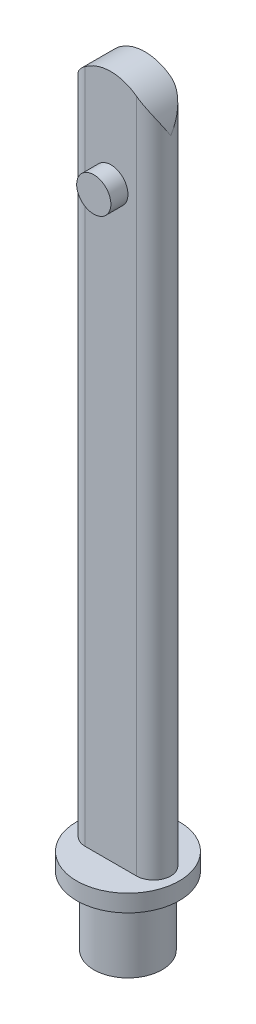
ISO-10303-21;
HEADER;
FILE_DESCRIPTION(('STEP AP214'),'2;1');
FILE_NAME('part.step','',(''),(''),'','','');
FILE_SCHEMA(('AUTOMOTIVE_DESIGN { 1 0 10303 214 1 1 1 1 }'));
ENDSEC;
DATA;
#1=APPLICATION_CONTEXT('core data for automotive mechanical design processes');
#2=APPLICATION_PROTOCOL_DEFINITION('international standard','automotive_design',2000,#1);
#3=PRODUCT_CONTEXT('',#1,'mechanical');
#4=PRODUCT('Part','Part','',(#3));
#5=PRODUCT_RELATED_PRODUCT_CATEGORY('part','',(#4));
#6=PRODUCT_DEFINITION_FORMATION('','',#4);
#7=PRODUCT_DEFINITION_CONTEXT('part definition',#1,'design');
#8=PRODUCT_DEFINITION('design','',#6,#7);
#9=PRODUCT_DEFINITION_SHAPE('','',#8);
#10=(LENGTH_UNIT() NAMED_UNIT(*) SI_UNIT(.MILLI.,.METRE.));
#11=(NAMED_UNIT(*) PLANE_ANGLE_UNIT() SI_UNIT($,.RADIAN.));
#12=(NAMED_UNIT(*) SI_UNIT($,.STERADIAN.) SOLID_ANGLE_UNIT());
#13=UNCERTAINTY_MEASURE_WITH_UNIT(LENGTH_MEASURE(1.E-05),#10,'distance_accuracy_value','');
#14=(GEOMETRIC_REPRESENTATION_CONTEXT(3) GLOBAL_UNCERTAINTY_ASSIGNED_CONTEXT((#13)) GLOBAL_UNIT_ASSIGNED_CONTEXT((#10,
#11,#12)) REPRESENTATION_CONTEXT('',''));
#15=CARTESIAN_POINT('',(0.,0.,0.));
#16=DIRECTION('',(0.,0.,1.));
#17=DIRECTION('',(1.,0.,0.));
#18=AXIS2_PLACEMENT_3D('',#15,#16,#17);
#19=CARTESIAN_POINT('',(0.,250.,0.));
#20=DIRECTION('',(0.,-1.,0.));
#21=DIRECTION('',(1.,0.,0.));
#22=AXIS2_PLACEMENT_3D('',#19,#20,#21);
#23=PLANE('',#22);
#24=CARTESIAN_POINT('',(0.,250.,0.));
#25=DIRECTION('',(0.,1.,0.));
#26=DIRECTION('',(-1.,0.,0.));
#27=AXIS2_PLACEMENT_3D('',#24,#25,#26);
#28=CIRCLE('',#27,150.);
#29=CARTESIAN_POINT('',(-150.,250.,0.));
#30=VERTEX_POINT('',#29);
#31=EDGE_CURVE('E45',#30,#30,#28,.T.);
#32=ORIENTED_EDGE('',*,*,#31,.T.);
#33=EDGE_LOOP('',(#32));
#34=FACE_BOUND('',#33,.T.);
#35=CARTESIAN_POINT('',(75.,250.,0.));
#36=DIRECTION('',(0.,1.,0.));
#37=DIRECTION('',(-1.,0.,0.));
#38=AXIS2_PLACEMENT_3D('',#35,#36,#37);
#39=CIRCLE('',#38,50.);
#40=CARTESIAN_POINT('',(75.,250.,50.));
#41=VERTEX_POINT('',#40);
#42=CARTESIAN_POINT('',(75.,250.,-50.));
#43=VERTEX_POINT('',#42);
#44=EDGE_CURVE('E204',#41,#43,#39,.T.);
#45=ORIENTED_EDGE('',*,*,#44,.F.);
#46=DIRECTION('',(1.,0.,0.));
#47=VECTOR('',#46,1.);
#48=CARTESIAN_POINT('',(-75.,250.,50.));
#49=LINE('',#48,#47);
#50=CARTESIAN_POINT('',(-75.,250.,50.));
#51=VERTEX_POINT('',#50);
#52=EDGE_CURVE('E213',#51,#41,#49,.T.);
#53=ORIENTED_EDGE('',*,*,#52,.F.);
#54=CARTESIAN_POINT('',(-75.,250.,0.));
#55=DIRECTION('',(0.,1.,0.));
#56=DIRECTION('',(-1.,0.,0.));
#57=AXIS2_PLACEMENT_3D('',#54,#55,#56);
#58=CIRCLE('',#57,50.);
#59=CARTESIAN_POINT('',(-75.,250.,-50.));
#60=VERTEX_POINT('',#59);
#61=EDGE_CURVE('E210',#60,#51,#58,.T.);
#62=ORIENTED_EDGE('',*,*,#61,.F.);
#63=DIRECTION('',(-1.,0.,0.));
#64=VECTOR('',#63,1.);
#65=CARTESIAN_POINT('',(-75.,250.,-50.));
#66=LINE('',#65,#64);
#67=EDGE_CURVE('E207',#43,#60,#66,.T.);
#68=ORIENTED_EDGE('',*,*,#67,.F.);
#69=EDGE_LOOP('',(#45,#53,#62,#68));
#70=FACE_BOUND('',#69,.T.);
#71=ADVANCED_FACE('F37',(#34,#70),#23,.F.);
#72=CARTESIAN_POINT('',(0.,250.,0.));
#73=DIRECTION('',(0.,1.,0.));
#74=DIRECTION('',(-1.,0.,0.));
#75=AXIS2_PLACEMENT_3D('',#72,#73,#74);
#76=CYLINDRICAL_SURFACE('',#75,150.);
#77=CARTESIAN_POINT('',(0.,200.,0.));
#78=DIRECTION('',(0.,1.,0.));
#79=DIRECTION('',(-1.,0.,0.));
#80=AXIS2_PLACEMENT_3D('',#77,#78,#79);
#81=CIRCLE('',#80,150.);
#82=CARTESIAN_POINT('',(-150.,200.,0.));
#83=VERTEX_POINT('',#82);
#84=EDGE_CURVE('E224',#83,#83,#81,.T.);
#85=ORIENTED_EDGE('',*,*,#84,.T.);
#86=EDGE_LOOP('',(#85));
#87=FACE_BOUND('',#86,.T.);
#88=ORIENTED_EDGE('',*,*,#31,.F.);
#89=EDGE_LOOP('',(#88));
#90=FACE_BOUND('',#89,.T.);
#91=ADVANCED_FACE('F39',(#87,#90),#76,.T.);
#92=CARTESIAN_POINT('',(0.,0.,0.));
#93=DIRECTION('',(0.,1.,0.));
#94=DIRECTION('',(-1.,0.,0.));
#95=AXIS2_PLACEMENT_3D('',#92,#93,#94);
#96=PLANE('',#95);
#97=CARTESIAN_POINT('',(0.,0.,0.));
#98=DIRECTION('',(0.,1.,0.));
#99=DIRECTION('',(-1.,0.,0.));
#100=AXIS2_PLACEMENT_3D('',#97,#98,#99);
#101=CIRCLE('',#100,100.);
#102=CARTESIAN_POINT('',(-100.,0.,0.));
#103=VERTEX_POINT('',#102);
#104=EDGE_CURVE('E230',#103,#103,#101,.T.);
#105=ORIENTED_EDGE('',*,*,#104,.F.);
#106=EDGE_LOOP('',(#105));
#107=FACE_BOUND('',#106,.T.);
#108=ADVANCED_FACE('F238',(#107),#96,.F.);
#109=CARTESIAN_POINT('',(0.,250.,0.));
#110=DIRECTION('',(0.,1.,0.));
#111=DIRECTION('',(-1.,0.,0.));
#112=AXIS2_PLACEMENT_3D('',#109,#110,#111);
#113=CYLINDRICAL_SURFACE('',#112,100.);
#114=ORIENTED_EDGE('',*,*,#104,.T.);
#115=EDGE_LOOP('',(#114));
#116=FACE_BOUND('',#115,.T.);
#117=CARTESIAN_POINT('',(0.,200.,0.));
#118=DIRECTION('',(0.,1.,0.));
#119=DIRECTION('',(-1.,0.,0.));
#120=AXIS2_PLACEMENT_3D('',#117,#118,#119);
#121=CIRCLE('',#120,100.);
#122=CARTESIAN_POINT('',(-100.,200.,0.));
#123=VERTEX_POINT('',#122);
#124=EDGE_CURVE('E227',#123,#123,#121,.T.);
#125=ORIENTED_EDGE('',*,*,#124,.F.);
#126=EDGE_LOOP('',(#125));
#127=FACE_BOUND('',#126,.T.);
#128=ADVANCED_FACE('F244',(#116,#127),#113,.T.);
#129=CARTESIAN_POINT('',(0.,200.,0.));
#130=DIRECTION('',(0.,1.,0.));
#131=DIRECTION('',(-1.,0.,0.));
#132=AXIS2_PLACEMENT_3D('',#129,#130,#131);
#133=PLANE('',#132);
#134=ORIENTED_EDGE('',*,*,#84,.F.);
#135=EDGE_LOOP('',(#134));
#136=FACE_BOUND('',#135,.T.);
#137=ORIENTED_EDGE('',*,*,#124,.T.);
#138=EDGE_LOOP('',(#137));
#139=FACE_BOUND('',#138,.T.);
#140=ADVANCED_FACE('F187',(#136,#139),#133,.F.);
#141=CARTESIAN_POINT('',(74.9999999999997,2250.,0.));
#142=DIRECTION('',(0.,-1.,0.));
#143=DIRECTION('',(1.,0.,0.));
#144=AXIS2_PLACEMENT_3D('',#141,#142,#143);
#145=CYLINDRICAL_SURFACE('',#144,50.);
#146=DIRECTION('',(0.,-1.,0.));
#147=VECTOR('',#146,1.);
#148=CARTESIAN_POINT('',(74.9999999999997,2250.,-50.));
#149=LINE('',#148,#147);
#150=CARTESIAN_POINT('',(74.9999999999998,2224.5,-50.));
#151=VERTEX_POINT('',#150);
#152=EDGE_CURVE('E222',#151,#43,#149,.T.);
#153=ORIENTED_EDGE('',*,*,#152,.F.);
#154=CARTESIAN_POINT('',(74.9999999999997,2224.5,-50.));
#155=CARTESIAN_POINT('',(75.854887691649,2223.85887026185,-49.9999948188799));
#156=CARTESIAN_POINT('',(76.7014274211285,2223.20680241624,-49.9780765631766));
#157=CARTESIAN_POINT('',(78.3760689163299,2221.88238680812,-49.8929354021623));
#158=CARTESIAN_POINT('',(79.2041749649752,2221.21004384369,-49.8297221972164));
#159=CARTESIAN_POINT('',(80.8392312522371,2219.84752077701,-49.6646494700732));
#160=CARTESIAN_POINT('',(81.6462147883371,2219.15737264049,-49.5628552487731));
#161=CARTESIAN_POINT('',(83.2393184012868,2217.75952639954,-49.3230431476938));
#162=CARTESIAN_POINT('',(84.0254371597551,2217.05182719156,-49.1850229848803));
#163=CARTESIAN_POINT('',(86.3361426340241,2214.91811626761,-48.723133574656));
#164=CARTESIAN_POINT('',(87.8290522518341,2213.46815540978,-48.3497276675442));
#165=CARTESIAN_POINT('',(90.7250700647439,2210.51305903308,-47.4869151179898));
#166=CARTESIAN_POINT('',(92.1281250179173,2209.00789161807,-46.9974404940063));
#167=CARTESIAN_POINT('',(94.4508996102796,2206.39106536218,-46.0732408701902));
#168=CARTESIAN_POINT('',(95.393524106517,2205.29080507118,-45.6632914849903));
#169=CARTESIAN_POINT('',(97.2315765482296,2203.0690725572,-44.7972015171427));
#170=CARTESIAN_POINT('',(98.1270003832541,2201.94759849835,-44.3410569216748));
#171=CARTESIAN_POINT('',(99.8707035667594,2199.68565223946,-43.3870481282565));
#172=CARTESIAN_POINT('',(100.718974965331,2198.54517687768,-42.8891769304652));
#173=CARTESIAN_POINT('',(102.368475154355,2196.24744160447,-41.8558679971915));
#174=CARTESIAN_POINT('',(103.169704905396,2195.09018203638,-41.3204310292921));
#175=CARTESIAN_POINT('',(104.729996272941,2192.75402675164,-40.2125355116804));
#176=CARTESIAN_POINT('',(105.488791970019,2191.57504538593,-39.6398836191737));
#177=CARTESIAN_POINT('',(106.959799421769,2189.20354170486,-38.4637234241761));
#178=CARTESIAN_POINT('',(107.67201133821,2188.01101943653,-37.8602152288514));
#179=CARTESIAN_POINT('',(109.05045112649,2185.61391491969,-36.6254411262667));
#180=CARTESIAN_POINT('',(109.716680379269,2184.40933303459,-35.9941760535274));
#181=CARTESIAN_POINT('',(111.003843506793,2181.98934811418,-34.7066549266084));
#182=CARTESIAN_POINT('',(111.624775326797,2180.7739445908,-34.0503977408118));
#183=CARTESIAN_POINT('',(113.070177723057,2177.82758638383,-32.4387160224586));
#184=CARTESIAN_POINT('',(113.872315957248,2176.09178093874,-31.4720514804115));
#185=CARTESIAN_POINT('',(115.389098466876,2172.60377491162,-29.5003044155452));
#186=CARTESIAN_POINT('',(116.103735360393,2170.85157295973,-28.4952186607513));
#187=CARTESIAN_POINT('',(117.447486065343,2167.33265754723,-26.4519686967151));
#188=CARTESIAN_POINT('',(118.076563450926,2165.56593824338,-25.4137906295834));
#189=CARTESIAN_POINT('',(119.250401058596,2162.02103215692,-23.3099332588289));
#190=CARTESIAN_POINT('',(119.795163641768,2160.24284569688,-22.2442547262829));
#191=CARTESIAN_POINT('',(120.800792857723,2156.68053562383,-20.0921677931301));
#192=CARTESIAN_POINT('',(121.261826029631,2154.89643114604,-19.0058053984274));
#193=CARTESIAN_POINT('',(122.102559806863,2151.32048686278,-16.814460616425));
#194=CARTESIAN_POINT('',(122.482258584525,2149.52864688442,-15.7094778113088));
#195=CARTESIAN_POINT('',(123.161140751831,2145.9398409694,-13.485387555064));
#196=CARTESIAN_POINT('',(123.460365987054,2144.14287818976,-12.3662877628381));
#197=CARTESIAN_POINT('',(123.979339914541,2140.54454176961,-10.1171219834942));
#198=CARTESIAN_POINT('',(124.1990939517,2138.74316843395,-8.98705673911677));
#199=CARTESIAN_POINT('',(124.585601476667,2134.878831529,-6.55678689463948));
#200=CARTESIAN_POINT('',(124.740240814421,2132.81538746176,-5.25541577038901));
#201=CARTESIAN_POINT('',(124.946904000051,2128.6878008176,-2.6485806818009));
#202=CARTESIAN_POINT('',(124.998999059404,2126.62365972172,-1.34312018876122));
#203=CARTESIAN_POINT('',(124.999995237359,2124.53984093101,-0.025197617413079));
#204=CARTESIAN_POINT('',(124.999999999237,2124.51992045361,-0.0125988011532162));
#205=CARTESIAN_POINT('',(125.,2124.5,0.));
#206=B_SPLINE_CURVE_WITH_KNOTS('',3,(#154,#155,#156,#157,#158,#159,#160,#161,#162,#163,#164,
#165,#166,#167,#168,#169,#170,#171,#172,#173,#174,#175,#176,#177,#178,#179,#180,#181,#182,#183,
#184,#185,#186,#187,#188,#189,#190,#191,#192,#193,#194,#195,#196,#197,#198,#199,#200,#201,#202,
#203,#204,#205),.UNSPECIFIED.,.F.,.F.,(4,2,2,2,2,2,2,2,2,2,2,2,2,2,2,2,2,2,2,2,2,2,2,2,2,4),(0.,
3.20527938884376,6.4098061140942,9.60893301586748,12.8082615817158,19.1444755624056,
25.4844098752056,29.9999920654861,34.5159668459779,39.0327007254657,43.5493423412075,
48.0916873505029,52.6340165849675,57.1762093458732,61.7186080176358,68.1440747392027,
74.5700831626448,80.9988188687401,87.4273745169927,93.8430001795845,100.258769992221,
106.671197178529,113.083193012111,120.414389720974,127.740493509952,127.811204189514),.UNSPECIFIED.);
#207=CARTESIAN_POINT('',(124.999999999999,2124.5,0.));
#208=VERTEX_POINT('',#207);
#209=EDGE_CURVE('E197',#151,#208,#206,.T.);
#210=ORIENTED_EDGE('',*,*,#209,.T.);
#211=CARTESIAN_POINT('',(74.9999999999997,2224.5,50.));
#212=CARTESIAN_POINT('',(75.854887691649,2223.85887026185,49.9999948188799));
#213=CARTESIAN_POINT('',(76.7014274211285,2223.20680241624,49.9780765631766));
#214=CARTESIAN_POINT('',(78.3760689163299,2221.88238680812,49.8929354021623));
#215=CARTESIAN_POINT('',(79.2041749649752,2221.21004384369,49.8297221972164));
#216=CARTESIAN_POINT('',(80.8392312522372,2219.84752077701,49.6646494700732));
#217=CARTESIAN_POINT('',(81.6462147883372,2219.15737264049,49.5628552487731));
#218=CARTESIAN_POINT('',(83.2393184012869,2217.75952639954,49.3230431476938));
#219=CARTESIAN_POINT('',(84.0254371597553,2217.05182719156,49.1850229848803));
#220=CARTESIAN_POINT('',(86.3361426340244,2214.91811626761,48.7231335746559));
#221=CARTESIAN_POINT('',(87.8290522518344,2213.46815540978,48.3497276675441));
#222=CARTESIAN_POINT('',(90.7250700647442,2210.51305903308,47.4869151179897));
#223=CARTESIAN_POINT('',(92.1281250179175,2209.00789161807,46.9974404940063));
#224=CARTESIAN_POINT('',(94.4508996102797,2206.39106536218,46.0732408701902));
#225=CARTESIAN_POINT('',(95.3935241065171,2205.29080507118,45.6632914849903));
#226=CARTESIAN_POINT('',(97.2315765482296,2203.0690725572,44.7972015171427));
#227=CARTESIAN_POINT('',(98.1270003832541,2201.94759849835,44.3410569216748));
#228=CARTESIAN_POINT('',(99.8707035667592,2199.68565223946,43.3870481282566));
#229=CARTESIAN_POINT('',(100.718974965331,2198.54517687768,42.8891769304653));
#230=CARTESIAN_POINT('',(102.368475154355,2196.24744160447,41.8558679971916));
#231=CARTESIAN_POINT('',(103.169704905396,2195.09018203638,41.3204310292923));
#232=CARTESIAN_POINT('',(104.729996272941,2192.75402675164,40.2125355116806));
#233=CARTESIAN_POINT('',(105.488791970019,2191.57504538593,39.6398836191739));
#234=CARTESIAN_POINT('',(106.959799421769,2189.20354170486,38.4637234241763));
#235=CARTESIAN_POINT('',(107.67201133821,2188.01101943653,37.8602152288517));
#236=CARTESIAN_POINT('',(109.05045112649,2185.61391491969,36.6254411262669));
#237=CARTESIAN_POINT('',(109.716680379269,2184.40933303459,35.9941760535275));
#238=CARTESIAN_POINT('',(111.003843506793,2181.98934811418,34.7066549266084));
#239=CARTESIAN_POINT('',(111.624775326797,2180.7739445908,34.0503977408118));
#240=CARTESIAN_POINT('',(113.070177723057,2177.82758638383,32.4387160224586));
#241=CARTESIAN_POINT('',(113.872315957248,2176.09178093874,31.4720514804115));
#242=CARTESIAN_POINT('',(115.389098466876,2172.60377491162,29.5003044155452));
#243=CARTESIAN_POINT('',(116.103735360393,2170.85157295973,28.4952186607513));
#244=CARTESIAN_POINT('',(117.447486065343,2167.33265754723,26.451968696715));
#245=CARTESIAN_POINT('',(118.076563450926,2165.56593824338,25.4137906295832));
#246=CARTESIAN_POINT('',(119.250401058596,2162.02103215692,23.3099332588288));
#247=CARTESIAN_POINT('',(119.795163641768,2160.24284569688,22.2442547262829));
#248=CARTESIAN_POINT('',(120.800792857723,2156.68053562383,20.0921677931301));
#249=CARTESIAN_POINT('',(121.261826029631,2154.89643114604,19.0058053984273));
#250=CARTESIAN_POINT('',(122.102559806863,2151.32048686278,16.8144606164248));
#251=CARTESIAN_POINT('',(122.482258584525,2149.52864688442,15.7094778113087));
#252=CARTESIAN_POINT('',(123.161140751831,2145.9398409694,13.485387555064));
#253=CARTESIAN_POINT('',(123.460365987054,2144.14287818976,12.3662877628381));
#254=CARTESIAN_POINT('',(123.979339914541,2140.54454176961,10.1171219834938));
#255=CARTESIAN_POINT('',(124.1990939517,2138.74316843395,8.98705673911606));
#256=CARTESIAN_POINT('',(124.585601476667,2134.878831529,6.55678689464009));
#257=CARTESIAN_POINT('',(124.740240814421,2132.81538746176,5.25541577039162));
#258=CARTESIAN_POINT('',(124.946904000051,2128.6878008176,2.64858068179868));
#259=CARTESIAN_POINT('',(124.998999059404,2126.62365972173,1.34312018875218));
#260=CARTESIAN_POINT('',(124.999995237359,2124.53984093101,0.0251976174130199));
#261=CARTESIAN_POINT('',(124.999999999237,2124.51992045361,0.0125988011531859));
#262=CARTESIAN_POINT('',(125.,2124.5,0.));
#263=B_SPLINE_CURVE_WITH_KNOTS('',3,(#211,#212,#213,#214,#215,#216,#217,#218,#219,#220,#221,
#222,#223,#224,#225,#226,#227,#228,#229,#230,#231,#232,#233,#234,#235,#236,#237,#238,#239,#240,
#241,#242,#243,#244,#245,#246,#247,#248,#249,#250,#251,#252,#253,#254,#255,#256,#257,#258,#259,
#260,#261,#262),.UNSPECIFIED.,.F.,.F.,(4,2,2,2,2,2,2,2,2,2,2,2,2,2,2,2,2,2,2,2,2,2,2,2,2,4),(0.,
3.20527938884375,6.40980611409422,9.60893301586751,12.8082615817159,19.1444755624063,
25.4844098752056,29.9999920654866,34.5159668459779,39.0327007254651,43.5493423412069,
48.0916873505023,52.6340165849669,57.1762093458731,61.7186080176358,68.1440747392027,
74.5700831626448,80.9988188687402,87.4273745169927,93.8430001795846,100.258769992221,
106.67119717853,113.083193012111,120.414389720974,127.740493509952,127.811204189514),.UNSPECIFIED.);
#264=CARTESIAN_POINT('',(74.9999999999998,2224.5,50.));
#265=VERTEX_POINT('',#264);
#266=EDGE_CURVE('E191',#208,#265,#263,.F.);
#267=ORIENTED_EDGE('',*,*,#266,.T.);
#268=DIRECTION('',(0.,-1.,0.));
#269=VECTOR('',#268,1.);
#270=CARTESIAN_POINT('',(74.9999999999997,2250.,50.));
#271=LINE('',#270,#269);
#272=EDGE_CURVE('E216',#265,#41,#271,.T.);
#273=ORIENTED_EDGE('',*,*,#272,.T.);
#274=ORIENTED_EDGE('',*,*,#44,.T.);
#275=EDGE_LOOP('',(#153,#210,#267,#273,#274));
#276=FACE_BOUND('',#275,.T.);
#277=ADVANCED_FACE('F182',(#276),#145,.T.);
#278=CARTESIAN_POINT('',(-75.0000000000003,2250.,-50.));
#279=DIRECTION('',(0.,0.,1.));
#280=DIRECTION('',(1.,0.,0.));
#281=AXIS2_PLACEMENT_3D('',#278,#279,#280);
#282=PLANE('',#281);
#283=DIRECTION('',(0.,-1.,0.));
#284=VECTOR('',#283,1.);
#285=CARTESIAN_POINT('',(-75.0000000000002,2250.,-50.));
#286=LINE('',#285,#284);
#287=CARTESIAN_POINT('',(-75.0000000000003,2224.5,-50.));
#288=VERTEX_POINT('',#287);
#289=EDGE_CURVE('E220',#288,#60,#286,.T.);
#290=ORIENTED_EDGE('',*,*,#289,.F.);
#291=CARTESIAN_POINT('',(-3.88578058618805E-13,2124.5,-50.));
#292=DIRECTION('',(0.,0.,-1.));
#293=DIRECTION('',(1.,0.,0.));
#294=AXIS2_PLACEMENT_3D('',#291,#292,#293);
#295=CIRCLE('',#294,125.);
#296=EDGE_CURVE('E150',#288,#151,#295,.T.);
#297=ORIENTED_EDGE('',*,*,#296,.T.);
#298=ORIENTED_EDGE('',*,*,#152,.T.);
#299=ORIENTED_EDGE('',*,*,#67,.T.);
#300=EDGE_LOOP('',(#290,#297,#298,#299));
#301=FACE_BOUND('',#300,.T.);
#302=ADVANCED_FACE('F177',(#301),#282,.F.);
#303=CARTESIAN_POINT('',(-75.0000000000003,2250.,0.));
#304=DIRECTION('',(0.,-1.,0.));
#305=DIRECTION('',(1.,0.,0.));
#306=AXIS2_PLACEMENT_3D('',#303,#304,#305);
#307=CYLINDRICAL_SURFACE('',#306,50.);
#308=DIRECTION('',(0.,-1.,0.));
#309=VECTOR('',#308,1.);
#310=CARTESIAN_POINT('',(-75.0000000000003,2250.,50.));
#311=LINE('',#310,#309);
#312=CARTESIAN_POINT('',(-75.0000000000003,2224.5,50.));
#313=VERTEX_POINT('',#312);
#314=EDGE_CURVE('E218',#313,#51,#311,.T.);
#315=ORIENTED_EDGE('',*,*,#314,.F.);
#316=CARTESIAN_POINT('',(-75.0000000000003,2224.5,50.));
#317=CARTESIAN_POINT('',(-75.8548876916735,2223.85887026184,49.9999948188799));
#318=CARTESIAN_POINT('',(-76.7014274211764,2223.20680241621,49.9780765631753));
#319=CARTESIAN_POINT('',(-78.3760689164234,2221.88238680805,49.8929354021564));
#320=CARTESIAN_POINT('',(-79.204174965091,2221.2100438436,49.829722197207));
#321=CARTESIAN_POINT('',(-80.8392312523962,2219.84752077687,49.6646494700549));
#322=CARTESIAN_POINT('',(-81.6462147885172,2219.15737264033,49.5628552487494));
#323=CARTESIAN_POINT('',(-83.2393184015071,2217.75952639934,49.3230431476575));
#324=CARTESIAN_POINT('',(-84.0254371599947,2217.05182719134,49.1850229848368));
#325=CARTESIAN_POINT('',(-86.3361426342345,2214.91811626741,48.7231335746056));
#326=CARTESIAN_POINT('',(-87.8290522519988,2213.46815540961,48.3497276674993));
#327=CARTESIAN_POINT('',(-90.7250700648227,2210.51305903299,47.4869151179625));
#328=CARTESIAN_POINT('',(-92.1281250179558,2209.00789161803,46.9974404939912));
#329=CARTESIAN_POINT('',(-94.4508996102654,2206.3910653622,46.0732408701961));
#330=CARTESIAN_POINT('',(-95.3935241064886,2205.29080507122,45.6632914850029));
#331=CARTESIAN_POINT('',(-97.2315765481746,2203.06907255727,44.7972015171699));
#332=CARTESIAN_POINT('',(-98.1270003831867,2201.94759849843,44.3410569217099));
#333=CARTESIAN_POINT('',(-99.8707035666678,2199.68565223958,43.3870481283089));
#334=CARTESIAN_POINT('',(-100.718974965228,2198.54517687782,42.8891769305271));
#335=CARTESIAN_POINT('',(-102.36847515423,2196.24744160465,41.8558679972733));
#336=CARTESIAN_POINT('',(-103.169704905261,2195.09018203658,41.3204310293843));
#337=CARTESIAN_POINT('',(-104.729996272811,2192.75402675184,40.2125355117775));
#338=CARTESIAN_POINT('',(-105.488791969903,2191.57504538612,39.6398836192641));
#339=CARTESIAN_POINT('',(-106.959799421679,2189.20354170501,38.4637234242521));
#340=CARTESIAN_POINT('',(-107.672011338132,2188.01101943667,37.8602152289197));
#341=CARTESIAN_POINT('',(-109.050451126436,2185.61391491979,36.6254411263176));
#342=CARTESIAN_POINT('',(-109.716680379227,2184.40933303467,35.9941760535686));
#343=CARTESIAN_POINT('',(-111.003843506774,2181.98934811422,34.7066549266295));
#344=CARTESIAN_POINT('',(-111.624775326788,2180.77394459082,34.0503977408225));
#345=CARTESIAN_POINT('',(-113.070177723068,2177.82758638381,32.4387160224468));
#346=CARTESIAN_POINT('',(-113.872315957269,2176.0917809387,31.4720514803872));
#347=CARTESIAN_POINT('',(-115.389098466913,2172.60377491154,29.500304415495));
#348=CARTESIAN_POINT('',(-116.103735360438,2170.85157295962,28.4952186606878));
#349=CARTESIAN_POINT('',(-117.447486065398,2167.33265754709,26.451968696628));
#350=CARTESIAN_POINT('',(-118.076563450985,2165.56593824321,25.4137906294862));
#351=CARTESIAN_POINT('',(-119.25040105866,2162.02103215672,23.3099332587083));
#352=CARTESIAN_POINT('',(-119.795163641834,2160.24284569666,22.2442547261488));
#353=CARTESIAN_POINT('',(-120.80079285778,2156.68053562362,20.0921677930022));
#354=CARTESIAN_POINT('',(-121.26182602968,2154.89643114584,19.0058053983196));
#355=CARTESIAN_POINT('',(-122.102559806896,2151.32048686264,16.8144606163221));
#356=CARTESIAN_POINT('',(-122.482258584551,2149.52864688431,15.7094778111907));
#357=CARTESIAN_POINT('',(-123.161140751846,2145.93984096929,13.4853875550504));
#358=CARTESIAN_POINT('',(-123.460365987065,2144.1428781896,12.3662877629439));
#359=CARTESIAN_POINT('',(-123.979339914546,2140.54454176968,10.117121983326));
#360=CARTESIAN_POINT('',(-124.199093951702,2138.74316843428,8.98705673855514));
#361=CARTESIAN_POINT('',(-124.585601476667,2134.8788315286,6.5567868952698));
#362=CARTESIAN_POINT('',(-124.740240814421,2132.81538746018,5.25541577289792));
#363=CARTESIAN_POINT('',(-124.946904000052,2128.68780081919,2.64858067929497));
#364=CARTESIAN_POINT('',(-124.998999059406,2126.62365972767,1.34312017936794));
#365=CARTESIAN_POINT('',(-124.99999523736,2124.53984093112,0.0251976172326532));
#366=CARTESIAN_POINT('',(-124.999999999238,2124.51992045366,0.0125988010622482));
#367=CARTESIAN_POINT('',(-125.,2124.5,0.));
#368=B_SPLINE_CURVE_WITH_KNOTS('',3,(#316,#317,#318,#319,#320,#321,#322,#323,#324,#325,#326,
#327,#328,#329,#330,#331,#332,#333,#334,#335,#336,#337,#338,#339,#340,#341,#342,#343,#344,#345,
#346,#347,#348,#349,#350,#351,#352,#353,#354,#355,#356,#357,#358,#359,#360,#361,#362,#363,#364,
#365,#366,#367),.UNSPECIFIED.,.F.,.F.,(4,2,2,2,2,2,2,2,2,2,2,2,2,2,2,2,2,2,2,2,2,2,2,2,2,4),(0.,
3.2052793889333,6.40980611427333,9.60893301613499,12.8082615820702,19.1444755625827,
25.4844098752058,29.9999920654174,34.5159668458404,39.0327007252564,43.5493423409265,
48.0916873502888,52.6340165848202,57.1762093458001,61.7186080176363,68.1440747392837,
74.5700831628062,80.9988188689611,87.427374517276,93.8430001797909,100.258769992344,
106.671197178587,113.083193012111,120.414389720967,127.740493509952,127.811204189514),.UNSPECIFIED.);
#369=CARTESIAN_POINT('',(-125.,2124.5,0.));
#370=VERTEX_POINT('',#369);
#371=EDGE_CURVE('E60',#313,#370,#368,.T.);
#372=ORIENTED_EDGE('',*,*,#371,.T.);
#373=CARTESIAN_POINT('',(-75.0000000000003,2224.5,-50.));
#374=CARTESIAN_POINT('',(-75.8548876916736,2223.85887026184,-49.9999948188799));
#375=CARTESIAN_POINT('',(-76.7014274211764,2223.20680241621,-49.9780765631753));
#376=CARTESIAN_POINT('',(-78.3760689164234,2221.88238680805,-49.8929354021564));
#377=CARTESIAN_POINT('',(-79.204174965091,2221.2100438436,-49.829722197207));
#378=CARTESIAN_POINT('',(-80.8392312523961,2219.84752077687,-49.6646494700549));
#379=CARTESIAN_POINT('',(-81.6462147885171,2219.15737264033,-49.5628552487494));
#380=CARTESIAN_POINT('',(-83.2393184015069,2217.75952639934,-49.3230431476575));
#381=CARTESIAN_POINT('',(-84.0254371599946,2217.05182719134,-49.1850229848368));
#382=CARTESIAN_POINT('',(-86.3361426342342,2214.91811626741,-48.7231335746057));
#383=CARTESIAN_POINT('',(-87.8290522519986,2213.46815540961,-48.3497276674993));
#384=CARTESIAN_POINT('',(-90.7250700648226,2210.51305903299,-47.4869151179625));
#385=CARTESIAN_POINT('',(-92.1281250179557,2209.00789161803,-46.9974404939912));
#386=CARTESIAN_POINT('',(-94.4508996102654,2206.3910653622,-46.0732408701961));
#387=CARTESIAN_POINT('',(-95.3935241064886,2205.29080507122,-45.6632914850029));
#388=CARTESIAN_POINT('',(-97.2315765481746,2203.06907255727,-44.7972015171699));
#389=CARTESIAN_POINT('',(-98.1270003831866,2201.94759849843,-44.3410569217099));
#390=CARTESIAN_POINT('',(-99.8707035666676,2199.68565223958,-43.387048128309));
#391=CARTESIAN_POINT('',(-100.718974965228,2198.54517687783,-42.8891769305272));
#392=CARTESIAN_POINT('',(-102.36847515423,2196.24744160465,-41.8558679972735));
#393=CARTESIAN_POINT('',(-103.169704905261,2195.09018203658,-41.3204310293845));
#394=CARTESIAN_POINT('',(-104.729996272811,2192.75402675184,-40.2125355117777));
#395=CARTESIAN_POINT('',(-105.488791969902,2191.57504538612,-39.6398836192643));
#396=CARTESIAN_POINT('',(-106.959799421678,2189.20354170501,-38.4637234242522));
#397=CARTESIAN_POINT('',(-107.672011338132,2188.01101943667,-37.8602152289198));
#398=CARTESIAN_POINT('',(-109.050451126436,2185.61391491979,-36.6254411263176));
#399=CARTESIAN_POINT('',(-109.716680379227,2184.40933303467,-35.9941760535686));
#400=CARTESIAN_POINT('',(-111.003843506774,2181.98934811422,-34.7066549266294));
#401=CARTESIAN_POINT('',(-111.624775326788,2180.77394459082,-34.0503977408225));
#402=CARTESIAN_POINT('',(-113.070177723068,2177.82758638381,-32.4387160224468));
#403=CARTESIAN_POINT('',(-113.872315957269,2176.0917809387,-31.4720514803871));
#404=CARTESIAN_POINT('',(-115.389098466913,2172.60377491154,-29.500304415495));
#405=CARTESIAN_POINT('',(-116.103735360438,2170.85157295962,-28.4952186606878));
#406=CARTESIAN_POINT('',(-117.447486065398,2167.33265754709,-26.4519686966281));
#407=CARTESIAN_POINT('',(-118.076563450985,2165.56593824321,-25.4137906294863));
#408=CARTESIAN_POINT('',(-119.25040105866,2162.02103215672,-23.3099332587082));
#409=CARTESIAN_POINT('',(-119.795163641834,2160.24284569666,-22.2442547261487));
#410=CARTESIAN_POINT('',(-120.80079285778,2156.68053562362,-20.092167793002));
#411=CARTESIAN_POINT('',(-121.26182602968,2154.89643114584,-19.0058053983193));
#412=CARTESIAN_POINT('',(-122.102559806896,2151.32048686264,-16.8144606163218));
#413=CARTESIAN_POINT('',(-122.482258584551,2149.52864688431,-15.7094778111905));
#414=CARTESIAN_POINT('',(-123.161140751846,2145.93984096929,-13.4853875550502));
#415=CARTESIAN_POINT('',(-123.460365987065,2144.1428781896,-12.3662877629437));
#416=CARTESIAN_POINT('',(-123.979339914546,2140.54454176968,-10.1171219833259));
#417=CARTESIAN_POINT('',(-124.199093951702,2138.74316843428,-8.98705673855538));
#418=CARTESIAN_POINT('',(-124.585601476667,2134.8788315286,-6.55678689526967));
#419=CARTESIAN_POINT('',(-124.740240814421,2132.81538746019,-5.25541577289697));
#420=CARTESIAN_POINT('',(-124.946904000052,2128.68780081919,-2.64858067929598));
#421=CARTESIAN_POINT('',(-124.998999059406,2126.62365972766,-1.34312017937172));
#422=CARTESIAN_POINT('',(-124.99999523736,2124.53984093112,-0.0251976172327537));
#423=CARTESIAN_POINT('',(-124.999999999238,2124.51992045366,-0.0125988010622988));
#424=CARTESIAN_POINT('',(-125.,2124.5,0.));
#425=B_SPLINE_CURVE_WITH_KNOTS('',3,(#373,#374,#375,#376,#377,#378,#379,#380,#381,#382,#383,
#384,#385,#386,#387,#388,#389,#390,#391,#392,#393,#394,#395,#396,#397,#398,#399,#400,#401,#402,
#403,#404,#405,#406,#407,#408,#409,#410,#411,#412,#413,#414,#415,#416,#417,#418,#419,#420,#421,
#422,#423,#424),.UNSPECIFIED.,.F.,.F.,(4,2,2,2,2,2,2,2,2,2,2,2,2,2,2,2,2,2,2,2,2,2,2,2,2,4),(0.,
3.2052793889333,6.4098061142733,9.60893301613451,12.8082615820702,19.1444755625822,
25.4844098752059,29.9999920654174,34.5159668458404,39.0327007252558,43.5493423409259,
48.0916873502886,52.6340165848201,57.1762093458001,61.7186080176363,68.1440747392841,
74.5700831628057,80.9988188689611,87.4273745172765,93.8430001797914,100.258769992345,
106.671197178587,113.083193012111,120.414389720967,127.740493509952,127.811204189514),.UNSPECIFIED.);
#426=EDGE_CURVE('E153',#370,#288,#425,.F.);
#427=ORIENTED_EDGE('',*,*,#426,.T.);
#428=ORIENTED_EDGE('',*,*,#289,.T.);
#429=ORIENTED_EDGE('',*,*,#61,.T.);
#430=EDGE_LOOP('',(#315,#372,#427,#428,#429));
#431=FACE_BOUND('',#430,.T.);
#432=ADVANCED_FACE('F172',(#431),#307,.T.);
#433=CARTESIAN_POINT('',(-75.0000000000003,2250.,50.));
#434=DIRECTION('',(0.,0.,-1.));
#435=DIRECTION('',(-1.,0.,0.));
#436=AXIS2_PLACEMENT_3D('',#433,#434,#435);
#437=PLANE('',#436);
#438=CARTESIAN_POINT('',(0.,1963.3040198785,50.));
#439=DIRECTION('',(0.,0.,-1.));
#440=DIRECTION('',(-1.,0.,0.));
#441=AXIS2_PLACEMENT_3D('',#438,#439,#440);
#442=CIRCLE('',#441,50.);
#443=CARTESIAN_POINT('',(-50.,1963.3040198785,50.));
#444=VERTEX_POINT('',#443);
#445=EDGE_CURVE('E11',#444,#444,#442,.F.);
#446=ORIENTED_EDGE('',*,*,#445,.F.);
#447=EDGE_LOOP('',(#446));
#448=FACE_BOUND('',#447,.T.);
#449=ORIENTED_EDGE('',*,*,#272,.F.);
#450=CARTESIAN_POINT('',(-3.88578058618805E-13,2124.5,50.));
#451=DIRECTION('',(0.,0.,-1.));
#452=DIRECTION('',(1.,0.,0.));
#453=AXIS2_PLACEMENT_3D('',#450,#451,#452);
#454=CIRCLE('',#453,125.);
#455=EDGE_CURVE('E149',#313,#265,#454,.T.);
#456=ORIENTED_EDGE('',*,*,#455,.F.);
#457=ORIENTED_EDGE('',*,*,#314,.T.);
#458=ORIENTED_EDGE('',*,*,#52,.T.);
#459=EDGE_LOOP('',(#449,#456,#457,#458));
#460=FACE_BOUND('',#459,.T.);
#461=ADVANCED_FACE('F176',(#448,#460),#437,.F.);
#462=CARTESIAN_POINT('',(-3.88578058618805E-13,2124.5,-50.));
#463=DIRECTION('',(0.,0.,1.));
#464=DIRECTION('',(1.,0.,0.));
#465=AXIS2_PLACEMENT_3D('',#462,#463,#464);
#466=CYLINDRICAL_SURFACE('',#465,125.);
#467=ORIENTED_EDGE('',*,*,#296,.F.);
#468=ORIENTED_EDGE('',*,*,#426,.F.);
#469=ORIENTED_EDGE('',*,*,#371,.F.);
#470=ORIENTED_EDGE('',*,*,#455,.T.);
#471=ORIENTED_EDGE('',*,*,#266,.F.);
#472=ORIENTED_EDGE('',*,*,#209,.F.);
#473=EDGE_LOOP('',(#467,#468,#469,#470,#471,#472));
#474=FACE_BOUND('',#473,.T.);
#475=ADVANCED_FACE('F168',(#474),#466,.T.);
#476=CARTESIAN_POINT('',(0.,1963.3040198785,100.));
#477=DIRECTION('',(0.,0.,-1.));
#478=DIRECTION('',(-1.,0.,0.));
#479=AXIS2_PLACEMENT_3D('',#476,#477,#478);
#480=CYLINDRICAL_SURFACE('',#479,50.);
#481=CARTESIAN_POINT('',(0.,1963.3040198785,100.));
#482=DIRECTION('',(0.,0.,1.));
#483=DIRECTION('',(1.,0.,0.));
#484=AXIS2_PLACEMENT_3D('',#481,#482,#483);
#485=CIRCLE('',#484,50.);
#486=CARTESIAN_POINT('',(50.,1963.3040198785,100.));
#487=VERTEX_POINT('',#486);
#488=EDGE_CURVE('E143',#487,#487,#485,.T.);
#489=ORIENTED_EDGE('',*,*,#488,.F.);
#490=EDGE_LOOP('',(#489));
#491=FACE_BOUND('',#490,.T.);
#492=ORIENTED_EDGE('',*,*,#445,.T.);
#493=EDGE_LOOP('',(#492));
#494=FACE_BOUND('',#493,.T.);
#495=ADVANCED_FACE('F290',(#491,#494),#480,.T.);
#496=CARTESIAN_POINT('',(0.,1963.3040198785,100.));
#497=DIRECTION('',(0.,0.,1.));
#498=DIRECTION('',(1.,0.,0.));
#499=AXIS2_PLACEMENT_3D('',#496,#497,#498);
#500=PLANE('',#499);
#501=DIRECTION('',(0.,-1.,0.));
#502=VECTOR('',#501,1.);
#503=CARTESIAN_POINT('',(0.,1963.3040198785,100.));
#504=LINE('',#503,#502);
#505=CARTESIAN_POINT('',(0.,1963.3040198785,100.));
#506=VERTEX_POINT('',#505);
#507=CARTESIAN_POINT('',(0.,1962.34766946521,100.));
#508=VERTEX_POINT('',#507);
#509=EDGE_CURVE('E52',#506,#508,#504,.T.);
#510=ORIENTED_EDGE('',*,*,#509,.F.);
#511=DIRECTION('',(-1.,0.,0.));
#512=VECTOR('',#511,1.);
#513=CARTESIAN_POINT('',(0.,1963.3040198785,100.));
#514=LINE('',#513,#512);
#515=CARTESIAN_POINT('',(0.943556427826511,1963.3040198785,100.));
#516=VERTEX_POINT('',#515);
#517=EDGE_CURVE('E128',#516,#506,#514,.T.);
#518=ORIENTED_EDGE('',*,*,#517,.F.);
#519=DIRECTION('',(0.,1.,0.));
#520=VECTOR('',#519,1.);
#521=CARTESIAN_POINT('',(0.943556427826511,1963.3040198785,100.));
#522=LINE('',#521,#520);
#523=CARTESIAN_POINT('',(0.943556427826511,1962.34766946521,100.));
#524=VERTEX_POINT('',#523);
#525=EDGE_CURVE('E131',#524,#516,#522,.T.);
#526=ORIENTED_EDGE('',*,*,#525,.F.);
#527=DIRECTION('',(1.,0.,0.));
#528=VECTOR('',#527,1.);
#529=CARTESIAN_POINT('',(0.,1962.34766946521,100.));
#530=LINE('',#529,#528);
#531=EDGE_CURVE('E137',#508,#524,#530,.T.);
#532=ORIENTED_EDGE('',*,*,#531,.F.);
#533=EDGE_LOOP('',(#510,#518,#526,#532));
#534=FACE_BOUND('',#533,.T.);
#535=ORIENTED_EDGE('',*,*,#488,.T.);
#536=EDGE_LOOP('',(#535));
#537=FACE_BOUND('',#536,.T.);
#538=ADVANCED_FACE('F295',(#534,#537),#500,.T.);
#539=CARTESIAN_POINT('',(0.,1963.3040198785,99.));
#540=DIRECTION('',(-1.,0.,0.));
#541=DIRECTION('',(0.,-1.,0.));
#542=AXIS2_PLACEMENT_3D('',#539,#540,#541);
#543=PLANE('',#542);
#544=ORIENTED_EDGE('',*,*,#509,.T.);
#545=DIRECTION('',(0.,0.,1.));
#546=VECTOR('',#545,1.);
#547=CARTESIAN_POINT('',(0.,1962.34766946521,99.));
#548=LINE('',#547,#546);
#549=CARTESIAN_POINT('',(0.,1962.34766946521,99.));
#550=VERTEX_POINT('',#549);
#551=EDGE_CURVE('E106',#550,#508,#548,.T.);
#552=ORIENTED_EDGE('',*,*,#551,.F.);
#553=DIRECTION('',(0.,-1.,0.));
#554=VECTOR('',#553,1.);
#555=CARTESIAN_POINT('',(0.,1963.3040198785,99.));
#556=LINE('',#555,#554);
#557=CARTESIAN_POINT('',(0.,1963.3040198785,99.));
#558=VERTEX_POINT('',#557);
#559=EDGE_CURVE('E110',#558,#550,#556,.T.);
#560=ORIENTED_EDGE('',*,*,#559,.F.);
#561=DIRECTION('',(0.,0.,1.));
#562=VECTOR('',#561,1.);
#563=CARTESIAN_POINT('',(0.,1963.3040198785,99.));
#564=LINE('',#563,#562);
#565=EDGE_CURVE('E141',#558,#506,#564,.T.);
#566=ORIENTED_EDGE('',*,*,#565,.T.);
#567=EDGE_LOOP('',(#544,#552,#560,#566));
#568=FACE_BOUND('',#567,.T.);
#569=ADVANCED_FACE('F108',(#568),#543,.F.);
#570=CARTESIAN_POINT('',(0.,1963.3040198785,99.));
#571=DIRECTION('',(0.,1.,0.));
#572=DIRECTION('',(0.,0.,1.));
#573=AXIS2_PLACEMENT_3D('',#570,#571,#572);
#574=PLANE('',#573);
#575=ORIENTED_EDGE('',*,*,#517,.T.);
#576=ORIENTED_EDGE('',*,*,#565,.F.);
#577=DIRECTION('',(-1.,0.,0.));
#578=VECTOR('',#577,1.);
#579=CARTESIAN_POINT('',(0.,1963.3040198785,99.));
#580=LINE('',#579,#578);
#581=CARTESIAN_POINT('',(0.943556427826511,1963.3040198785,99.));
#582=VERTEX_POINT('',#581);
#583=EDGE_CURVE('E116',#582,#558,#580,.T.);
#584=ORIENTED_EDGE('',*,*,#583,.F.);
#585=DIRECTION('',(0.,0.,1.));
#586=VECTOR('',#585,1.);
#587=CARTESIAN_POINT('',(0.943556427826511,1963.3040198785,99.));
#588=LINE('',#587,#586);
#589=EDGE_CURVE('E144',#582,#516,#588,.T.);
#590=ORIENTED_EDGE('',*,*,#589,.T.);
#591=EDGE_LOOP('',(#575,#576,#584,#590));
#592=FACE_BOUND('',#591,.T.);
#593=ADVANCED_FACE('F309',(#592),#574,.F.);
#594=CARTESIAN_POINT('',(0.943556427826511,1963.3040198785,99.));
#595=DIRECTION('',(1.,0.,0.));
#596=DIRECTION('',(0.,1.,0.));
#597=AXIS2_PLACEMENT_3D('',#594,#595,#596);
#598=PLANE('',#597);
#599=ORIENTED_EDGE('',*,*,#525,.T.);
#600=ORIENTED_EDGE('',*,*,#589,.F.);
#601=DIRECTION('',(0.,1.,0.));
#602=VECTOR('',#601,1.);
#603=CARTESIAN_POINT('',(0.943556427826511,1963.3040198785,99.));
#604=LINE('',#603,#602);
#605=CARTESIAN_POINT('',(0.943556427826511,1962.34766946521,99.));
#606=VERTEX_POINT('',#605);
#607=EDGE_CURVE('E124',#606,#582,#604,.T.);
#608=ORIENTED_EDGE('',*,*,#607,.F.);
#609=DIRECTION('',(0.,0.,1.));
#610=VECTOR('',#609,1.);
#611=CARTESIAN_POINT('',(0.943556427826511,1962.34766946521,99.));
#612=LINE('',#611,#610);
#613=EDGE_CURVE('E115',#606,#524,#612,.T.);
#614=ORIENTED_EDGE('',*,*,#613,.T.);
#615=EDGE_LOOP('',(#599,#600,#608,#614));
#616=FACE_BOUND('',#615,.T.);
#617=ADVANCED_FACE('F316',(#616),#598,.F.);
#618=CARTESIAN_POINT('',(0.,1962.34766946521,99.));
#619=DIRECTION('',(0.,-1.,0.));
#620=DIRECTION('',(0.,0.,-1.));
#621=AXIS2_PLACEMENT_3D('',#618,#619,#620);
#622=PLANE('',#621);
#623=ORIENTED_EDGE('',*,*,#531,.T.);
#624=ORIENTED_EDGE('',*,*,#613,.F.);
#625=DIRECTION('',(1.,0.,0.));
#626=VECTOR('',#625,1.);
#627=CARTESIAN_POINT('',(0.,1962.34766946521,99.));
#628=LINE('',#627,#626);
#629=EDGE_CURVE('E119',#550,#606,#628,.T.);
#630=ORIENTED_EDGE('',*,*,#629,.F.);
#631=ORIENTED_EDGE('',*,*,#551,.T.);
#632=EDGE_LOOP('',(#623,#624,#630,#631));
#633=FACE_BOUND('',#632,.T.);
#634=ADVANCED_FACE('F120',(#633),#622,.F.);
#635=CARTESIAN_POINT('',(0.,0.,99.));
#636=DIRECTION('',(0.,0.,1.));
#637=DIRECTION('',(1.,0.,0.));
#638=AXIS2_PLACEMENT_3D('',#635,#636,#637);
#639=PLANE('',#638);
#640=ORIENTED_EDGE('',*,*,#559,.T.);
#641=ORIENTED_EDGE('',*,*,#629,.T.);
#642=ORIENTED_EDGE('',*,*,#607,.T.);
#643=ORIENTED_EDGE('',*,*,#583,.T.);
#644=EDGE_LOOP('',(#640,#641,#642,#643));
#645=FACE_BOUND('',#644,.T.);
#646=ADVANCED_FACE('F126',(#645),#639,.T.);
#647=CLOSED_SHELL('',(#71,#91,#108,#128,#140,#277,#302,#432,#461,#475,#495,#538,#569,#593,#617,
#634,#646));
#648=MANIFOLD_SOLID_BREP('B2',#647);
#649=ADVANCED_BREP_SHAPE_REPRESENTATION('',(#18,#648),#14);
#650=SHAPE_DEFINITION_REPRESENTATION(#9,#649);
ENDSEC;
END-ISO-10303-21;
